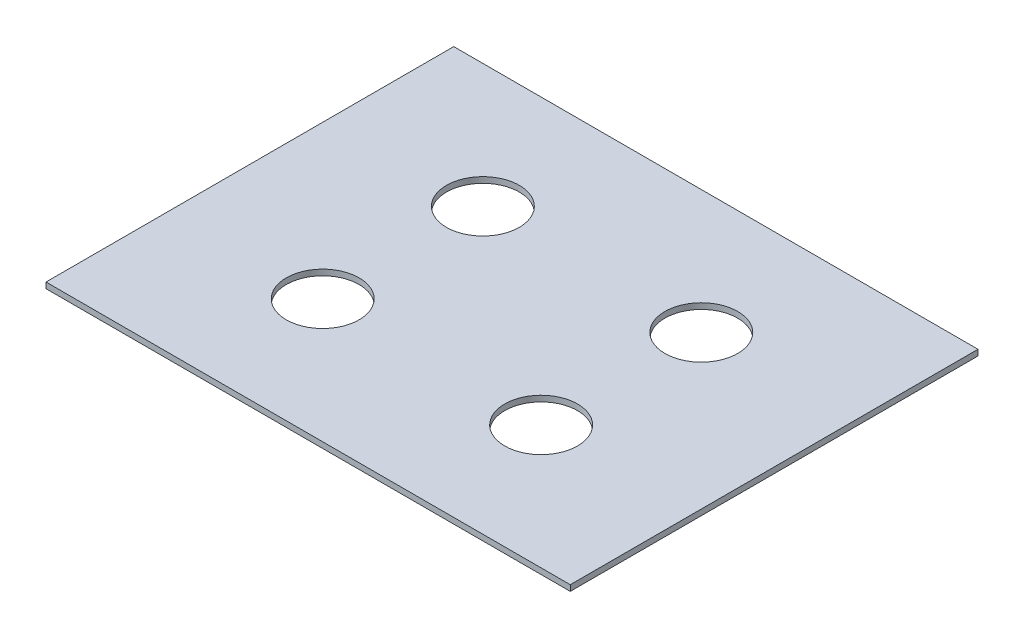
ISO-10303-21;
HEADER;
FILE_DESCRIPTION(('STEP AP214'),'2;1');
FILE_NAME('part.step','',(''),(''),'','','');
FILE_SCHEMA(('AUTOMOTIVE_DESIGN { 1 0 10303 214 1 1 1 1 }'));
ENDSEC;
DATA;
#1=APPLICATION_CONTEXT('core data for automotive mechanical design processes');
#2=APPLICATION_PROTOCOL_DEFINITION('international standard','automotive_design',2000,#1);
#3=PRODUCT_CONTEXT('',#1,'mechanical');
#4=PRODUCT('Part','Part','',(#3));
#5=PRODUCT_RELATED_PRODUCT_CATEGORY('part','',(#4));
#6=PRODUCT_DEFINITION_FORMATION('','',#4);
#7=PRODUCT_DEFINITION_CONTEXT('part definition',#1,'design');
#8=PRODUCT_DEFINITION('design','',#6,#7);
#9=PRODUCT_DEFINITION_SHAPE('','',#8);
#10=(LENGTH_UNIT() NAMED_UNIT(*) SI_UNIT(.MILLI.,.METRE.));
#11=(NAMED_UNIT(*) PLANE_ANGLE_UNIT() SI_UNIT($,.RADIAN.));
#12=(NAMED_UNIT(*) SI_UNIT($,.STERADIAN.) SOLID_ANGLE_UNIT());
#13=UNCERTAINTY_MEASURE_WITH_UNIT(LENGTH_MEASURE(1.E-05),#10,'distance_accuracy_value','');
#14=(GEOMETRIC_REPRESENTATION_CONTEXT(3) GLOBAL_UNCERTAINTY_ASSIGNED_CONTEXT((#13)) GLOBAL_UNIT_ASSIGNED_CONTEXT((#10,
#11,#12)) REPRESENTATION_CONTEXT('',''));
#15=CARTESIAN_POINT('',(0.,0.,0.));
#16=DIRECTION('',(0.,0.,1.));
#17=DIRECTION('',(1.,0.,0.));
#18=AXIS2_PLACEMENT_3D('',#15,#16,#17);
#19=CARTESIAN_POINT('',(114.3,2.54,-88.8999999999999));
#20=DIRECTION('',(-1.,0.,0.));
#21=DIRECTION('',(0.,0.,1.));
#22=AXIS2_PLACEMENT_3D('',#19,#20,#21);
#23=PLANE('',#22);
#24=DIRECTION('',(0.,0.,-1.));
#25=VECTOR('',#24,1.);
#26=CARTESIAN_POINT('',(114.3,0.,-88.8999999999999));
#27=LINE('',#26,#25);
#28=CARTESIAN_POINT('',(114.3,0.,88.9));
#29=VERTEX_POINT('',#28);
#30=CARTESIAN_POINT('',(114.3,0.,-88.8999999999999));
#31=VERTEX_POINT('',#30);
#32=EDGE_CURVE('E102',#29,#31,#27,.T.);
#33=ORIENTED_EDGE('',*,*,#32,.T.);
#34=DIRECTION('',(0.,-1.,0.));
#35=VECTOR('',#34,1.);
#36=CARTESIAN_POINT('',(114.3,2.54,-88.8999999999999));
#37=LINE('',#36,#35);
#38=CARTESIAN_POINT('',(114.3,2.54,-88.8999999999999));
#39=VERTEX_POINT('',#38);
#40=EDGE_CURVE('E11',#39,#31,#37,.T.);
#41=ORIENTED_EDGE('',*,*,#40,.F.);
#42=DIRECTION('',(0.,0.,-1.));
#43=VECTOR('',#42,1.);
#44=CARTESIAN_POINT('',(114.3,2.54,-88.8999999999999));
#45=LINE('',#44,#43);
#46=CARTESIAN_POINT('',(114.3,2.54,88.9));
#47=VERTEX_POINT('',#46);
#48=EDGE_CURVE('E90',#47,#39,#45,.T.);
#49=ORIENTED_EDGE('',*,*,#48,.F.);
#50=DIRECTION('',(0.,-1.,0.));
#51=VECTOR('',#50,1.);
#52=CARTESIAN_POINT('',(114.3,2.54,88.9));
#53=LINE('',#52,#51);
#54=EDGE_CURVE('E98',#47,#29,#53,.T.);
#55=ORIENTED_EDGE('',*,*,#54,.T.);
#56=EDGE_LOOP('',(#33,#41,#49,#55));
#57=FACE_BOUND('',#56,.T.);
#58=ADVANCED_FACE('F39',(#57),#23,.F.);
#59=CARTESIAN_POINT('',(-114.3,2.54,-88.8999999999999));
#60=DIRECTION('',(0.,0.,1.));
#61=DIRECTION('',(1.,0.,0.));
#62=AXIS2_PLACEMENT_3D('',#59,#60,#61);
#63=PLANE('',#62);
#64=DIRECTION('',(-1.,0.,0.));
#65=VECTOR('',#64,1.);
#66=CARTESIAN_POINT('',(-114.3,0.,-88.8999999999999));
#67=LINE('',#66,#65);
#68=CARTESIAN_POINT('',(-114.3,0.,-88.8999999999999));
#69=VERTEX_POINT('',#68);
#70=EDGE_CURVE('E94',#31,#69,#67,.T.);
#71=ORIENTED_EDGE('',*,*,#70,.T.);
#72=DIRECTION('',(0.,-1.,0.));
#73=VECTOR('',#72,1.);
#74=CARTESIAN_POINT('',(-114.3,2.54,-88.8999999999999));
#75=LINE('',#74,#73);
#76=CARTESIAN_POINT('',(-114.3,2.54,-88.8999999999999));
#77=VERTEX_POINT('',#76);
#78=EDGE_CURVE('E47',#77,#69,#75,.T.);
#79=ORIENTED_EDGE('',*,*,#78,.F.);
#80=DIRECTION('',(-1.,0.,0.));
#81=VECTOR('',#80,1.);
#82=CARTESIAN_POINT('',(-114.3,2.54,-88.8999999999999));
#83=LINE('',#82,#81);
#84=EDGE_CURVE('E85',#39,#77,#83,.T.);
#85=ORIENTED_EDGE('',*,*,#84,.F.);
#86=ORIENTED_EDGE('',*,*,#40,.T.);
#87=EDGE_LOOP('',(#71,#79,#85,#86));
#88=FACE_BOUND('',#87,.T.);
#89=ADVANCED_FACE('F93',(#88),#63,.F.);
#90=CARTESIAN_POINT('',(-114.3,2.54,-88.8999999999999));
#91=DIRECTION('',(1.,0.,0.));
#92=DIRECTION('',(0.,0.,-1.));
#93=AXIS2_PLACEMENT_3D('',#90,#91,#92);
#94=PLANE('',#93);
#95=DIRECTION('',(0.,0.,1.));
#96=VECTOR('',#95,1.);
#97=CARTESIAN_POINT('',(-114.3,0.,-88.8999999999999));
#98=LINE('',#97,#96);
#99=CARTESIAN_POINT('',(-114.3,0.,88.9));
#100=VERTEX_POINT('',#99);
#101=EDGE_CURVE('E72',#69,#100,#98,.T.);
#102=ORIENTED_EDGE('',*,*,#101,.T.);
#103=DIRECTION('',(0.,-1.,0.));
#104=VECTOR('',#103,1.);
#105=CARTESIAN_POINT('',(-114.3,2.54,88.9));
#106=LINE('',#105,#104);
#107=CARTESIAN_POINT('',(-114.3,2.54,88.9));
#108=VERTEX_POINT('',#107);
#109=EDGE_CURVE('E95',#108,#100,#106,.T.);
#110=ORIENTED_EDGE('',*,*,#109,.F.);
#111=DIRECTION('',(0.,0.,1.));
#112=VECTOR('',#111,1.);
#113=CARTESIAN_POINT('',(-114.3,2.54,-88.8999999999999));
#114=LINE('',#113,#112);
#115=EDGE_CURVE('E88',#77,#108,#114,.T.);
#116=ORIENTED_EDGE('',*,*,#115,.F.);
#117=ORIENTED_EDGE('',*,*,#78,.T.);
#118=EDGE_LOOP('',(#102,#110,#116,#117));
#119=FACE_BOUND('',#118,.T.);
#120=ADVANCED_FACE('F96',(#119),#94,.F.);
#121=CARTESIAN_POINT('',(-114.3,2.54,88.9));
#122=DIRECTION('',(0.,0.,-1.));
#123=DIRECTION('',(-1.,0.,0.));
#124=AXIS2_PLACEMENT_3D('',#121,#122,#123);
#125=PLANE('',#124);
#126=DIRECTION('',(1.,0.,0.));
#127=VECTOR('',#126,1.);
#128=CARTESIAN_POINT('',(-114.3,0.,88.9));
#129=LINE('',#128,#127);
#130=EDGE_CURVE('E78',#100,#29,#129,.T.);
#131=ORIENTED_EDGE('',*,*,#130,.T.);
#132=ORIENTED_EDGE('',*,*,#54,.F.);
#133=DIRECTION('',(1.,0.,0.));
#134=VECTOR('',#133,1.);
#135=CARTESIAN_POINT('',(-114.3,2.54,88.9));
#136=LINE('',#135,#134);
#137=EDGE_CURVE('E55',#108,#47,#136,.T.);
#138=ORIENTED_EDGE('',*,*,#137,.F.);
#139=ORIENTED_EDGE('',*,*,#109,.T.);
#140=EDGE_LOOP('',(#131,#132,#138,#139));
#141=FACE_BOUND('',#140,.T.);
#142=ADVANCED_FACE('F110',(#141),#125,.F.);
#143=CARTESIAN_POINT('',(0.,2.54,0.));
#144=DIRECTION('',(0.,1.,0.));
#145=DIRECTION('',(0.,0.,1.));
#146=AXIS2_PLACEMENT_3D('',#143,#144,#145);
#147=PLANE('',#146);
#148=CARTESIAN_POINT('',(-47.625,2.54,34.925));
#149=DIRECTION('',(0.,1.,0.));
#150=DIRECTION('',(0.,0.,1.));
#151=AXIS2_PLACEMENT_3D('',#148,#149,#150);
#152=CIRCLE('',#151,15.875);
#153=CARTESIAN_POINT('',(-47.625,2.54,50.8));
#154=VERTEX_POINT('',#153);
#155=EDGE_CURVE('E125',#154,#154,#152,.T.);
#156=ORIENTED_EDGE('',*,*,#155,.F.);
#157=EDGE_LOOP('',(#156));
#158=FACE_BOUND('',#157,.T.);
#159=CARTESIAN_POINT('',(47.625,2.54,34.925));
#160=DIRECTION('',(0.,1.,0.));
#161=DIRECTION('',(0.,0.,1.));
#162=AXIS2_PLACEMENT_3D('',#159,#160,#161);
#163=CIRCLE('',#162,15.875);
#164=CARTESIAN_POINT('',(47.625,2.54,50.8));
#165=VERTEX_POINT('',#164);
#166=EDGE_CURVE('E131',#165,#165,#163,.T.);
#167=ORIENTED_EDGE('',*,*,#166,.F.);
#168=EDGE_LOOP('',(#167));
#169=FACE_BOUND('',#168,.T.);
#170=CARTESIAN_POINT('',(47.625,2.54,-34.925));
#171=DIRECTION('',(0.,1.,0.));
#172=DIRECTION('',(0.,0.,1.));
#173=AXIS2_PLACEMENT_3D('',#170,#171,#172);
#174=CIRCLE('',#173,15.875);
#175=CARTESIAN_POINT('',(47.625,2.54,-19.05));
#176=VERTEX_POINT('',#175);
#177=EDGE_CURVE('E119',#176,#176,#174,.T.);
#178=ORIENTED_EDGE('',*,*,#177,.F.);
#179=EDGE_LOOP('',(#178));
#180=FACE_BOUND('',#179,.T.);
#181=CARTESIAN_POINT('',(-47.625,2.54,-34.925));
#182=DIRECTION('',(0.,1.,0.));
#183=DIRECTION('',(0.,0.,1.));
#184=AXIS2_PLACEMENT_3D('',#181,#182,#183);
#185=CIRCLE('',#184,15.875);
#186=CARTESIAN_POINT('',(-47.625,2.54,-19.05));
#187=VERTEX_POINT('',#186);
#188=EDGE_CURVE('E116',#187,#187,#185,.T.);
#189=ORIENTED_EDGE('',*,*,#188,.F.);
#190=EDGE_LOOP('',(#189));
#191=FACE_BOUND('',#190,.T.);
#192=ORIENTED_EDGE('',*,*,#48,.T.);
#193=ORIENTED_EDGE('',*,*,#84,.T.);
#194=ORIENTED_EDGE('',*,*,#115,.T.);
#195=ORIENTED_EDGE('',*,*,#137,.T.);
#196=EDGE_LOOP('',(#192,#193,#194,#195));
#197=FACE_BOUND('',#196,.T.);
#198=ADVANCED_FACE('F86',(#158,#169,#180,#191,#197),#147,.T.);
#199=CARTESIAN_POINT('',(0.,0.,0.));
#200=DIRECTION('',(0.,1.,0.));
#201=DIRECTION('',(0.,0.,1.));
#202=AXIS2_PLACEMENT_3D('',#199,#200,#201);
#203=PLANE('',#202);
#204=CARTESIAN_POINT('',(-47.625,0.,34.925));
#205=DIRECTION('',(0.,1.,0.));
#206=DIRECTION('',(0.,0.,1.));
#207=AXIS2_PLACEMENT_3D('',#204,#205,#206);
#208=CIRCLE('',#207,15.875);
#209=CARTESIAN_POINT('',(-47.625,0.,50.8));
#210=VERTEX_POINT('',#209);
#211=EDGE_CURVE('E122',#210,#210,#208,.T.);
#212=ORIENTED_EDGE('',*,*,#211,.T.);
#213=EDGE_LOOP('',(#212));
#214=FACE_BOUND('',#213,.T.);
#215=CARTESIAN_POINT('',(47.625,0.,34.925));
#216=DIRECTION('',(0.,1.,0.));
#217=DIRECTION('',(0.,0.,1.));
#218=AXIS2_PLACEMENT_3D('',#215,#216,#217);
#219=CIRCLE('',#218,15.875);
#220=CARTESIAN_POINT('',(47.625,0.,50.8));
#221=VERTEX_POINT('',#220);
#222=EDGE_CURVE('E128',#221,#221,#219,.T.);
#223=ORIENTED_EDGE('',*,*,#222,.T.);
#224=EDGE_LOOP('',(#223));
#225=FACE_BOUND('',#224,.T.);
#226=CARTESIAN_POINT('',(47.625,0.,-34.925));
#227=DIRECTION('',(0.,1.,0.));
#228=DIRECTION('',(0.,0.,1.));
#229=AXIS2_PLACEMENT_3D('',#226,#227,#228);
#230=CIRCLE('',#229,15.875);
#231=CARTESIAN_POINT('',(47.625,0.,-19.05));
#232=VERTEX_POINT('',#231);
#233=EDGE_CURVE('E134',#232,#232,#230,.T.);
#234=ORIENTED_EDGE('',*,*,#233,.T.);
#235=EDGE_LOOP('',(#234));
#236=FACE_BOUND('',#235,.T.);
#237=CARTESIAN_POINT('',(-47.625,0.,-34.925));
#238=DIRECTION('',(0.,1.,0.));
#239=DIRECTION('',(0.,0.,1.));
#240=AXIS2_PLACEMENT_3D('',#237,#238,#239);
#241=CIRCLE('',#240,15.875);
#242=CARTESIAN_POINT('',(-47.625,0.,-19.05));
#243=VERTEX_POINT('',#242);
#244=EDGE_CURVE('E105',#243,#243,#241,.T.);
#245=ORIENTED_EDGE('',*,*,#244,.T.);
#246=EDGE_LOOP('',(#245));
#247=FACE_BOUND('',#246,.T.);
#248=ORIENTED_EDGE('',*,*,#32,.F.);
#249=ORIENTED_EDGE('',*,*,#130,.F.);
#250=ORIENTED_EDGE('',*,*,#101,.F.);
#251=ORIENTED_EDGE('',*,*,#70,.F.);
#252=EDGE_LOOP('',(#248,#249,#250,#251));
#253=FACE_BOUND('',#252,.T.);
#254=ADVANCED_FACE('F113',(#214,#225,#236,#247,#253),#203,.F.);
#255=CARTESIAN_POINT('',(-47.625,0.,-34.925));
#256=DIRECTION('',(0.,1.,0.));
#257=DIRECTION('',(0.,0.,1.));
#258=AXIS2_PLACEMENT_3D('',#255,#256,#257);
#259=CYLINDRICAL_SURFACE('',#258,15.875);
#260=ORIENTED_EDGE('',*,*,#244,.F.);
#261=EDGE_LOOP('',(#260));
#262=FACE_BOUND('',#261,.T.);
#263=ORIENTED_EDGE('',*,*,#188,.T.);
#264=EDGE_LOOP('',(#263));
#265=FACE_BOUND('',#264,.T.);
#266=ADVANCED_FACE('F148',(#262,#265),#259,.F.);
#267=CARTESIAN_POINT('',(47.625,0.,-34.925));
#268=DIRECTION('',(0.,1.,0.));
#269=DIRECTION('',(0.,0.,1.));
#270=AXIS2_PLACEMENT_3D('',#267,#268,#269);
#271=CYLINDRICAL_SURFACE('',#270,15.875);
#272=ORIENTED_EDGE('',*,*,#233,.F.);
#273=EDGE_LOOP('',(#272));
#274=FACE_BOUND('',#273,.T.);
#275=ORIENTED_EDGE('',*,*,#177,.T.);
#276=EDGE_LOOP('',(#275));
#277=FACE_BOUND('',#276,.T.);
#278=ADVANCED_FACE('F140',(#274,#277),#271,.F.);
#279=CARTESIAN_POINT('',(47.625,0.,34.925));
#280=DIRECTION('',(0.,1.,0.));
#281=DIRECTION('',(0.,0.,1.));
#282=AXIS2_PLACEMENT_3D('',#279,#280,#281);
#283=CYLINDRICAL_SURFACE('',#282,15.875);
#284=ORIENTED_EDGE('',*,*,#222,.F.);
#285=EDGE_LOOP('',(#284));
#286=FACE_BOUND('',#285,.T.);
#287=ORIENTED_EDGE('',*,*,#166,.T.);
#288=EDGE_LOOP('',(#287));
#289=FACE_BOUND('',#288,.T.);
#290=ADVANCED_FACE('F156',(#286,#289),#283,.F.);
#291=CARTESIAN_POINT('',(-47.625,0.,34.925));
#292=DIRECTION('',(0.,1.,0.));
#293=DIRECTION('',(0.,0.,1.));
#294=AXIS2_PLACEMENT_3D('',#291,#292,#293);
#295=CYLINDRICAL_SURFACE('',#294,15.875);
#296=ORIENTED_EDGE('',*,*,#211,.F.);
#297=EDGE_LOOP('',(#296));
#298=FACE_BOUND('',#297,.T.);
#299=ORIENTED_EDGE('',*,*,#155,.T.);
#300=EDGE_LOOP('',(#299));
#301=FACE_BOUND('',#300,.T.);
#302=ADVANCED_FACE('F207',(#298,#301),#295,.F.);
#303=CLOSED_SHELL('',(#58,#89,#120,#142,#198,#254,#266,#278,#290,#302));
#304=MANIFOLD_SOLID_BREP('B2',#303);
#305=ADVANCED_BREP_SHAPE_REPRESENTATION('',(#18,#304),#14);
#306=SHAPE_DEFINITION_REPRESENTATION(#9,#305);
ENDSEC;
END-ISO-10303-21;
